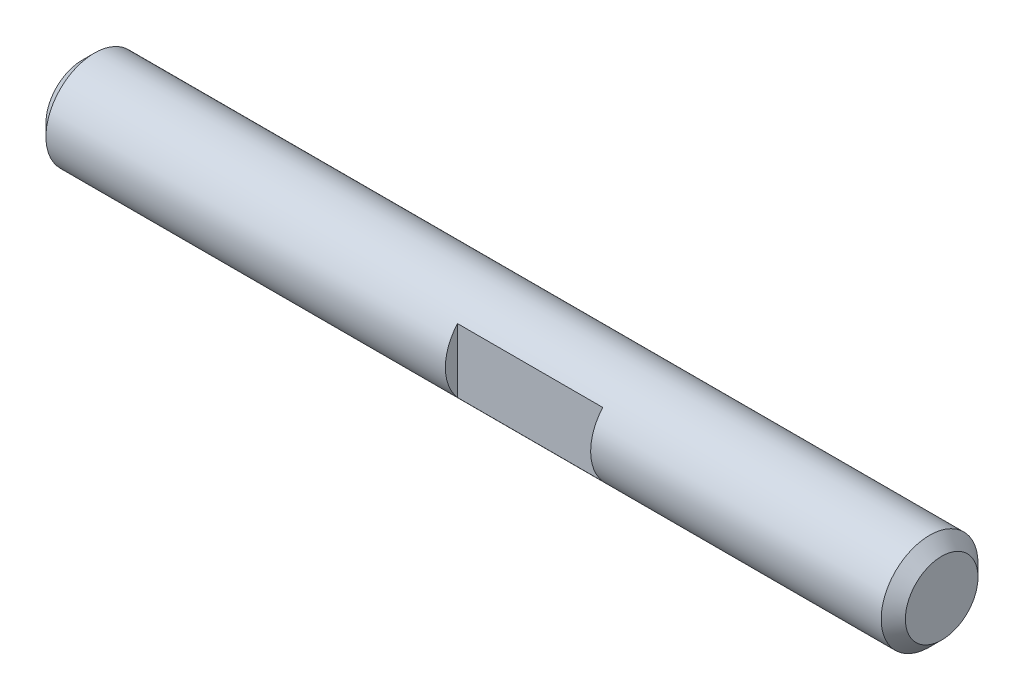
ISO-10303-21;
HEADER;
FILE_DESCRIPTION(('STEP AP214'),'2;1');
FILE_NAME('part.step','',(''),(''),'','','');
FILE_SCHEMA(('AUTOMOTIVE_DESIGN { 1 0 10303 214 1 1 1 1 }'));
ENDSEC;
DATA;
#1=APPLICATION_CONTEXT('core data for automotive mechanical design processes');
#2=APPLICATION_PROTOCOL_DEFINITION('international standard','automotive_design',2000,#1);
#3=PRODUCT_CONTEXT('',#1,'mechanical');
#4=PRODUCT('Part','Part','',(#3));
#5=PRODUCT_RELATED_PRODUCT_CATEGORY('part','',(#4));
#6=PRODUCT_DEFINITION_FORMATION('','',#4);
#7=PRODUCT_DEFINITION_CONTEXT('part definition',#1,'design');
#8=PRODUCT_DEFINITION('design','',#6,#7);
#9=PRODUCT_DEFINITION_SHAPE('','',#8);
#10=(LENGTH_UNIT() NAMED_UNIT(*) SI_UNIT(.MILLI.,.METRE.));
#11=(NAMED_UNIT(*) PLANE_ANGLE_UNIT() SI_UNIT($,.RADIAN.));
#12=(NAMED_UNIT(*) SI_UNIT($,.STERADIAN.) SOLID_ANGLE_UNIT());
#13=UNCERTAINTY_MEASURE_WITH_UNIT(LENGTH_MEASURE(1.E-05),#10,'distance_accuracy_value','');
#14=(GEOMETRIC_REPRESENTATION_CONTEXT(3) GLOBAL_UNCERTAINTY_ASSIGNED_CONTEXT((#13)) GLOBAL_UNIT_ASSIGNED_CONTEXT((#10,
#11,#12)) REPRESENTATION_CONTEXT('',''));
#15=CARTESIAN_POINT('',(0.,0.,0.));
#16=DIRECTION('',(0.,0.,1.));
#17=DIRECTION('',(1.,0.,0.));
#18=AXIS2_PLACEMENT_3D('',#15,#16,#17);
#19=CARTESIAN_POINT('',(35.5,0.,0.));
#20=DIRECTION('',(1.,0.,0.));
#21=DIRECTION('',(0.,0.,-1.));
#22=AXIS2_PLACEMENT_3D('',#19,#20,#21);
#23=CYLINDRICAL_SURFACE('',#22,2.);
#24=CARTESIAN_POINT('',(35.,0.,0.));
#25=DIRECTION('',(1.,0.,0.));
#26=DIRECTION('',(0.,0.,-1.));
#27=AXIS2_PLACEMENT_3D('',#24,#25,#26);
#28=CIRCLE('',#27,2.);
#29=CARTESIAN_POINT('',(35.,0.,-2.));
#30=VERTEX_POINT('',#29);
#31=EDGE_CURVE('E78',#30,#30,#28,.T.);
#32=ORIENTED_EDGE('',*,*,#31,.F.);
#33=EDGE_LOOP('',(#32));
#34=FACE_BOUND('',#33,.T.);
#35=CARTESIAN_POINT('',(0.5,0.,0.));
#36=DIRECTION('',(1.,0.,0.));
#37=DIRECTION('',(0.,0.,-1.));
#38=AXIS2_PLACEMENT_3D('',#35,#36,#37);
#39=CIRCLE('',#38,2.);
#40=CARTESIAN_POINT('',(0.5,0.,-2.));
#41=VERTEX_POINT('',#40);
#42=EDGE_CURVE('E75',#41,#41,#39,.T.);
#43=ORIENTED_EDGE('',*,*,#42,.T.);
#44=EDGE_LOOP('',(#43));
#45=FACE_BOUND('',#44,.T.);
#46=CARTESIAN_POINT('',(23.,0.,0.));
#47=DIRECTION('',(-1.,0.,0.));
#48=DIRECTION('',(0.,-0.661437827766148,0.75));
#49=AXIS2_PLACEMENT_3D('',#46,#47,#48);
#50=CIRCLE('',#49,2.);
#51=CARTESIAN_POINT('',(23.,-1.3228756555323,1.5));
#52=VERTEX_POINT('',#51);
#53=CARTESIAN_POINT('',(23.,1.32287565553229,1.5));
#54=VERTEX_POINT('',#53);
#55=EDGE_CURVE('E66',#52,#54,#50,.T.);
#56=ORIENTED_EDGE('',*,*,#55,.F.);
#57=DIRECTION('',(1.,0.,0.));
#58=VECTOR('',#57,1.);
#59=CARTESIAN_POINT('',(17.,-1.32287565553229,1.5));
#60=LINE('',#59,#58);
#61=CARTESIAN_POINT('',(17.,-1.3228756555323,1.5));
#62=VERTEX_POINT('',#61);
#63=EDGE_CURVE('E55',#62,#52,#60,.T.);
#64=ORIENTED_EDGE('',*,*,#63,.F.);
#65=CARTESIAN_POINT('',(17.,0.,0.));
#66=DIRECTION('',(1.,0.,0.));
#67=DIRECTION('',(0.,0.661437827766148,0.75));
#68=AXIS2_PLACEMENT_3D('',#65,#66,#67);
#69=CIRCLE('',#68,2.);
#70=CARTESIAN_POINT('',(17.,1.3228756555323,1.5));
#71=VERTEX_POINT('',#70);
#72=EDGE_CURVE('E65',#71,#62,#69,.T.);
#73=ORIENTED_EDGE('',*,*,#72,.F.);
#74=DIRECTION('',(-1.,0.,0.));
#75=VECTOR('',#74,1.);
#76=CARTESIAN_POINT('',(23.,1.32287565553229,1.5));
#77=LINE('',#76,#75);
#78=EDGE_CURVE('E74',#54,#71,#77,.T.);
#79=ORIENTED_EDGE('',*,*,#78,.F.);
#80=EDGE_LOOP('',(#56,#64,#73,#79));
#81=FACE_BOUND('',#80,.T.);
#82=DIRECTION('',(1.,0.,0.));
#83=VECTOR('',#82,1.);
#84=CARTESIAN_POINT('',(17.,-0.637600277910515,-1.89564392373896));
#85=LINE('',#84,#83);
#86=CARTESIAN_POINT('',(17.,-0.637600277910515,-1.89564392373896));
#87=VERTEX_POINT('',#86);
#88=CARTESIAN_POINT('',(23.,-0.637600277910515,-1.89564392373896));
#89=VERTEX_POINT('',#88);
#90=EDGE_CURVE('E90',#87,#89,#85,.T.);
#91=ORIENTED_EDGE('',*,*,#90,.F.);
#92=CARTESIAN_POINT('',(17.,0.,0.));
#93=DIRECTION('',(1.,0.,0.));
#94=DIRECTION('',(0.,-0.980237966721403,0.197821961869479));
#95=AXIS2_PLACEMENT_3D('',#92,#93,#94);
#96=CIRCLE('',#95,2.);
#97=CARTESIAN_POINT('',(17.,-1.96047593344281,0.395643923738958));
#98=VERTEX_POINT('',#97);
#99=EDGE_CURVE('E95',#98,#87,#96,.T.);
#100=ORIENTED_EDGE('',*,*,#99,.F.);
#101=DIRECTION('',(-1.,0.,0.));
#102=VECTOR('',#101,1.);
#103=CARTESIAN_POINT('',(23.,-1.96047593344281,0.395643923738958));
#104=LINE('',#103,#102);
#105=CARTESIAN_POINT('',(23.,-1.96047593344281,0.395643923738958));
#106=VERTEX_POINT('',#105);
#107=EDGE_CURVE('E99',#106,#98,#104,.T.);
#108=ORIENTED_EDGE('',*,*,#107,.F.);
#109=CARTESIAN_POINT('',(23.,0.,0.));
#110=DIRECTION('',(-1.,0.,0.));
#111=DIRECTION('',(0.,-0.318800138955257,-0.947821961869479));
#112=AXIS2_PLACEMENT_3D('',#109,#110,#111);
#113=CIRCLE('',#112,2.);
#114=EDGE_CURVE('E34',#89,#106,#113,.T.);
#115=ORIENTED_EDGE('',*,*,#114,.F.);
#116=EDGE_LOOP('',(#91,#100,#108,#115));
#117=FACE_BOUND('',#116,.T.);
#118=ADVANCED_FACE('F17',(#34,#45,#81,#117),#23,.T.);
#119=CARTESIAN_POINT('',(35.,0.,0.));
#120=DIRECTION('',(-1.,0.,0.));
#121=DIRECTION('',(0.,0.,1.));
#122=AXIS2_PLACEMENT_3D('',#119,#120,#121);
#123=CONICAL_SURFACE('',#122,2.,0.785398163397448);
#124=CARTESIAN_POINT('',(35.5,0.,0.));
#125=DIRECTION('',(1.,0.,0.));
#126=DIRECTION('',(0.,0.,-1.));
#127=AXIS2_PLACEMENT_3D('',#124,#125,#126);
#128=CIRCLE('',#127,1.5);
#129=CARTESIAN_POINT('',(35.5,0.,-1.5));
#130=VERTEX_POINT('',#129);
#131=EDGE_CURVE('E107',#130,#130,#128,.T.);
#132=ORIENTED_EDGE('',*,*,#131,.F.);
#133=EDGE_LOOP('',(#132));
#134=FACE_BOUND('',#133,.T.);
#135=ORIENTED_EDGE('',*,*,#31,.T.);
#136=EDGE_LOOP('',(#135));
#137=FACE_BOUND('',#136,.T.);
#138=ADVANCED_FACE('F134',(#134,#137),#123,.T.);
#139=CARTESIAN_POINT('',(0.,0.,0.));
#140=DIRECTION('',(1.,0.,0.));
#141=DIRECTION('',(0.,0.,-1.));
#142=AXIS2_PLACEMENT_3D('',#139,#140,#141);
#143=CONICAL_SURFACE('',#142,1.5,0.785398163397448);
#144=ORIENTED_EDGE('',*,*,#42,.F.);
#145=EDGE_LOOP('',(#144));
#146=FACE_BOUND('',#145,.T.);
#147=CARTESIAN_POINT('',(0.,0.,0.));
#148=DIRECTION('',(1.,0.,0.));
#149=DIRECTION('',(0.,0.,-1.));
#150=AXIS2_PLACEMENT_3D('',#147,#148,#149);
#151=CIRCLE('',#150,1.5);
#152=CARTESIAN_POINT('',(0.,0.,-1.5));
#153=VERTEX_POINT('',#152);
#154=EDGE_CURVE('E71',#153,#153,#151,.T.);
#155=ORIENTED_EDGE('',*,*,#154,.T.);
#156=EDGE_LOOP('',(#155));
#157=FACE_BOUND('',#156,.T.);
#158=ADVANCED_FACE('F123',(#146,#157),#143,.T.);
#159=CARTESIAN_POINT('',(23.,4.,2.));
#160=DIRECTION('',(-1.,0.,0.));
#161=DIRECTION('',(0.,0.,1.));
#162=AXIS2_PLACEMENT_3D('',#159,#160,#161);
#163=PLANE('',#162);
#164=ORIENTED_EDGE('',*,*,#55,.T.);
#165=DIRECTION('',(0.,-1.,0.));
#166=VECTOR('',#165,1.);
#167=CARTESIAN_POINT('',(23.,1.32287565553229,1.5));
#168=LINE('',#167,#166);
#169=EDGE_CURVE('E59',#54,#52,#168,.T.);
#170=ORIENTED_EDGE('',*,*,#169,.T.);
#171=EDGE_LOOP('',(#164,#170));
#172=FACE_BOUND('',#171,.T.);
#173=ADVANCED_FACE('F70',(#172),#163,.T.);
#174=CARTESIAN_POINT('',(23.,4.,1.5));
#175=DIRECTION('',(0.,0.,1.));
#176=DIRECTION('',(1.,0.,0.));
#177=AXIS2_PLACEMENT_3D('',#174,#175,#176);
#178=PLANE('',#177);
#179=ORIENTED_EDGE('',*,*,#63,.T.);
#180=ORIENTED_EDGE('',*,*,#169,.F.);
#181=ORIENTED_EDGE('',*,*,#78,.T.);
#182=DIRECTION('',(0.,-1.,0.));
#183=VECTOR('',#182,1.);
#184=CARTESIAN_POINT('',(17.,1.3228756555323,1.5));
#185=LINE('',#184,#183);
#186=EDGE_CURVE('E61',#71,#62,#185,.T.);
#187=ORIENTED_EDGE('',*,*,#186,.T.);
#188=EDGE_LOOP('',(#179,#180,#181,#187));
#189=FACE_BOUND('',#188,.T.);
#190=ADVANCED_FACE('F57',(#189),#178,.T.);
#191=CARTESIAN_POINT('',(17.,4.,1.5));
#192=DIRECTION('',(1.,0.,0.));
#193=DIRECTION('',(0.,0.,-1.));
#194=AXIS2_PLACEMENT_3D('',#191,#192,#193);
#195=PLANE('',#194);
#196=ORIENTED_EDGE('',*,*,#186,.F.);
#197=ORIENTED_EDGE('',*,*,#72,.T.);
#198=EDGE_LOOP('',(#196,#197));
#199=FACE_BOUND('',#198,.T.);
#200=ADVANCED_FACE('F152',(#199),#195,.T.);
#201=CARTESIAN_POINT('',(23.,-3.29903810567666,2.71410161513775));
#202=DIRECTION('',(0.,-0.866025403784439,-0.5));
#203=DIRECTION('',(0.,0.5,-0.866025403784439));
#204=AXIS2_PLACEMENT_3D('',#201,#202,#203);
#205=PLANE('',#204);
#206=ORIENTED_EDGE('',*,*,#90,.T.);
#207=DIRECTION('',(0.,0.5,-0.866025403784439));
#208=VECTOR('',#207,1.);
#209=CARTESIAN_POINT('',(23.,-1.9604759334428,0.395643923738958));
#210=LINE('',#209,#208);
#211=EDGE_CURVE('E26',#106,#89,#210,.T.);
#212=ORIENTED_EDGE('',*,*,#211,.F.);
#213=ORIENTED_EDGE('',*,*,#107,.T.);
#214=DIRECTION('',(0.,0.5,-0.866025403784439));
#215=VECTOR('',#214,1.);
#216=CARTESIAN_POINT('',(17.,-1.9604759334428,0.395643923738958));
#217=LINE('',#216,#215);
#218=EDGE_CURVE('E11',#98,#87,#217,.T.);
#219=ORIENTED_EDGE('',*,*,#218,.T.);
#220=EDGE_LOOP('',(#206,#212,#213,#219));
#221=FACE_BOUND('',#220,.T.);
#222=ADVANCED_FACE('F155',(#221),#205,.T.);
#223=CARTESIAN_POINT('',(17.,-3.29903810567666,2.71410161513775));
#224=DIRECTION('',(1.,0.,0.));
#225=DIRECTION('',(0.,0.,-1.));
#226=AXIS2_PLACEMENT_3D('',#223,#224,#225);
#227=PLANE('',#226);
#228=ORIENTED_EDGE('',*,*,#99,.T.);
#229=ORIENTED_EDGE('',*,*,#218,.F.);
#230=EDGE_LOOP('',(#228,#229));
#231=FACE_BOUND('',#230,.T.);
#232=ADVANCED_FACE('F159',(#231),#227,.T.);
#233=CARTESIAN_POINT('',(23.,-3.73205080756888,2.46410161513775));
#234=DIRECTION('',(-1.,0.,0.));
#235=DIRECTION('',(0.,0.,1.));
#236=AXIS2_PLACEMENT_3D('',#233,#234,#235);
#237=PLANE('',#236);
#238=ORIENTED_EDGE('',*,*,#211,.T.);
#239=ORIENTED_EDGE('',*,*,#114,.T.);
#240=EDGE_LOOP('',(#238,#239));
#241=FACE_BOUND('',#240,.T.);
#242=ADVANCED_FACE('F131',(#241),#237,.T.);
#243=CARTESIAN_POINT('',(35.5,1.5,0.));
#244=DIRECTION('',(-1.,0.,0.));
#245=DIRECTION('',(0.,0.,1.));
#246=AXIS2_PLACEMENT_3D('',#243,#244,#245);
#247=PLANE('',#246);
#248=ORIENTED_EDGE('',*,*,#131,.T.);
#249=EDGE_LOOP('',(#248));
#250=FACE_BOUND('',#249,.T.);
#251=ADVANCED_FACE('F126',(#250),#247,.F.);
#252=CARTESIAN_POINT('',(0.,0.,0.));
#253=DIRECTION('',(1.,0.,0.));
#254=DIRECTION('',(0.,0.,-1.));
#255=AXIS2_PLACEMENT_3D('',#252,#253,#254);
#256=PLANE('',#255);
#257=ORIENTED_EDGE('',*,*,#154,.F.);
#258=EDGE_LOOP('',(#257));
#259=FACE_BOUND('',#258,.T.);
#260=ADVANCED_FACE('F19',(#259),#256,.F.);
#261=CLOSED_SHELL('',(#118,#138,#158,#173,#190,#200,#222,#232,#242,#251,#260));
#262=MANIFOLD_SOLID_BREP('B1',#261);
#263=ADVANCED_BREP_SHAPE_REPRESENTATION('',(#18,#262),#14);
#264=SHAPE_DEFINITION_REPRESENTATION(#9,#263);
ENDSEC;
END-ISO-10303-21;
